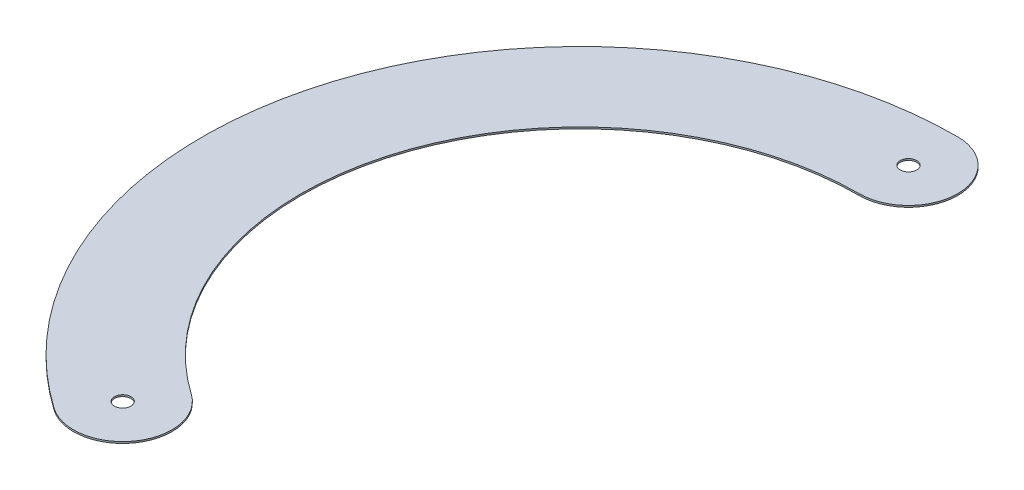
ISO-10303-21;
HEADER;
FILE_DESCRIPTION(('STEP AP214'),'2;1');
FILE_NAME('part.step','',(''),(''),'','','');
FILE_SCHEMA(('AUTOMOTIVE_DESIGN { 1 0 10303 214 1 1 1 1 }'));
ENDSEC;
DATA;
#1=APPLICATION_CONTEXT('core data for automotive mechanical design processes');
#2=APPLICATION_PROTOCOL_DEFINITION('international standard','automotive_design',2000,#1);
#3=PRODUCT_CONTEXT('',#1,'mechanical');
#4=PRODUCT('Part','Part','',(#3));
#5=PRODUCT_RELATED_PRODUCT_CATEGORY('part','',(#4));
#6=PRODUCT_DEFINITION_FORMATION('','',#4);
#7=PRODUCT_DEFINITION_CONTEXT('part definition',#1,'design');
#8=PRODUCT_DEFINITION('design','',#6,#7);
#9=PRODUCT_DEFINITION_SHAPE('','',#8);
#10=(LENGTH_UNIT() NAMED_UNIT(*) SI_UNIT(.MILLI.,.METRE.));
#11=(NAMED_UNIT(*) PLANE_ANGLE_UNIT() SI_UNIT($,.RADIAN.));
#12=(NAMED_UNIT(*) SI_UNIT($,.STERADIAN.) SOLID_ANGLE_UNIT());
#13=UNCERTAINTY_MEASURE_WITH_UNIT(LENGTH_MEASURE(1.E-05),#10,'distance_accuracy_value','');
#14=(GEOMETRIC_REPRESENTATION_CONTEXT(3) GLOBAL_UNCERTAINTY_ASSIGNED_CONTEXT((#13)) GLOBAL_UNIT_ASSIGNED_CONTEXT((#10,
#11,#12)) REPRESENTATION_CONTEXT('',''));
#15=CARTESIAN_POINT('',(0.,0.,0.));
#16=DIRECTION('',(0.,0.,1.));
#17=DIRECTION('',(1.,0.,0.));
#18=AXIS2_PLACEMENT_3D('',#15,#16,#17);
#19=CARTESIAN_POINT('',(0.,0.15,-15.));
#20=DIRECTION('',(0.,1.,0.));
#21=DIRECTION('',(0.,0.,1.));
#22=AXIS2_PLACEMENT_3D('',#19,#20,#21);
#23=PLANE('',#22);
#24=CARTESIAN_POINT('',(0.,0.15,-30.));
#25=DIRECTION('',(0.,1.,0.));
#26=DIRECTION('',(0.,0.,1.));
#27=AXIS2_PLACEMENT_3D('',#24,#25,#26);
#28=CIRCLE('',#27,0.750000000000001);
#29=CARTESIAN_POINT('',(0.,0.15,-29.25));
#30=VERTEX_POINT('',#29);
#31=EDGE_CURVE('E100',#30,#30,#28,.T.);
#32=ORIENTED_EDGE('',*,*,#31,.F.);
#33=EDGE_LOOP('',(#32));
#34=FACE_BOUND('',#33,.T.);
#35=CARTESIAN_POINT('',(0.,0.15,-30.));
#36=DIRECTION('',(0.,1.,0.));
#37=DIRECTION('',(0.,0.,1.));
#38=AXIS2_PLACEMENT_3D('',#35,#36,#37);
#39=CIRCLE('',#38,4.5);
#40=CARTESIAN_POINT('',(0.,0.15,-25.5));
#41=VERTEX_POINT('',#40);
#42=CARTESIAN_POINT('',(0.,0.15,-34.5));
#43=VERTEX_POINT('',#42);
#44=EDGE_CURVE('E85',#41,#43,#39,.T.);
#45=ORIENTED_EDGE('',*,*,#44,.T.);
#46=CARTESIAN_POINT('',(0.,0.15,0.));
#47=DIRECTION('',(0.,1.,0.));
#48=DIRECTION('',(0.,0.,1.));
#49=AXIS2_PLACEMENT_3D('',#46,#47,#48);
#50=CIRCLE('',#49,34.5);
#51=CARTESIAN_POINT('',(-19.7883870541111,0.15,28.2607455279702));
#52=VERTEX_POINT('',#51);
#53=EDGE_CURVE('E80',#43,#52,#50,.T.);
#54=ORIENTED_EDGE('',*,*,#53,.T.);
#55=CARTESIAN_POINT('',(-17.2072930905314,0.15,24.5745613286697));
#56=DIRECTION('',(0.,1.,0.));
#57=DIRECTION('',(0.,0.,1.));
#58=AXIS2_PLACEMENT_3D('',#55,#56,#57);
#59=CIRCLE('',#58,4.49999999999999);
#60=CARTESIAN_POINT('',(-14.6261991269517,0.15,20.8883771293693));
#61=VERTEX_POINT('',#60);
#62=EDGE_CURVE('E83',#52,#61,#59,.T.);
#63=ORIENTED_EDGE('',*,*,#62,.T.);
#64=CARTESIAN_POINT('',(0.,0.15,0.));
#65=DIRECTION('',(0.,-1.,0.));
#66=DIRECTION('',(0.,0.,1.));
#67=AXIS2_PLACEMENT_3D('',#64,#65,#66);
#68=CIRCLE('',#67,25.5);
#69=EDGE_CURVE('E50',#61,#41,#68,.T.);
#70=ORIENTED_EDGE('',*,*,#69,.T.);
#71=EDGE_LOOP('',(#45,#54,#63,#70));
#72=FACE_BOUND('',#71,.T.);
#73=CARTESIAN_POINT('',(-17.2072930905314,0.15,24.5745613286697));
#74=DIRECTION('',(0.,1.,0.));
#75=DIRECTION('',(0.,0.,1.));
#76=AXIS2_PLACEMENT_3D('',#73,#74,#75);
#77=CIRCLE('',#76,0.750000000000002);
#78=CARTESIAN_POINT('',(-17.2072930905314,0.15,25.3245613286697));
#79=VERTEX_POINT('',#78);
#80=EDGE_CURVE('E115',#79,#79,#77,.T.);
#81=ORIENTED_EDGE('',*,*,#80,.F.);
#82=EDGE_LOOP('',(#81));
#83=FACE_BOUND('',#82,.T.);
#84=ADVANCED_FACE('F33',(#34,#72,#83),#23,.T.);
#85=CARTESIAN_POINT('',(0.,0.,-15.));
#86=DIRECTION('',(0.,1.,0.));
#87=DIRECTION('',(0.,0.,1.));
#88=AXIS2_PLACEMENT_3D('',#85,#86,#87);
#89=PLANE('',#88);
#90=CARTESIAN_POINT('',(0.,0.,-30.));
#91=DIRECTION('',(0.,1.,0.));
#92=DIRECTION('',(0.,0.,1.));
#93=AXIS2_PLACEMENT_3D('',#90,#91,#92);
#94=CIRCLE('',#93,4.5);
#95=CARTESIAN_POINT('',(0.,0.,-25.5));
#96=VERTEX_POINT('',#95);
#97=CARTESIAN_POINT('',(0.,0.,-34.5));
#98=VERTEX_POINT('',#97);
#99=EDGE_CURVE('E97',#96,#98,#94,.T.);
#100=ORIENTED_EDGE('',*,*,#99,.F.);
#101=CARTESIAN_POINT('',(0.,0.,0.));
#102=DIRECTION('',(0.,-1.,0.));
#103=DIRECTION('',(0.,0.,1.));
#104=AXIS2_PLACEMENT_3D('',#101,#102,#103);
#105=CIRCLE('',#104,25.5);
#106=CARTESIAN_POINT('',(-14.6261991269517,0.,20.8883771293693));
#107=VERTEX_POINT('',#106);
#108=EDGE_CURVE('E73',#107,#96,#105,.T.);
#109=ORIENTED_EDGE('',*,*,#108,.F.);
#110=CARTESIAN_POINT('',(-17.2072930905314,0.,24.5745613286697));
#111=DIRECTION('',(0.,1.,0.));
#112=DIRECTION('',(0.,0.,1.));
#113=AXIS2_PLACEMENT_3D('',#110,#111,#112);
#114=CIRCLE('',#113,4.49999999999999);
#115=CARTESIAN_POINT('',(-19.7883870541111,0.,28.2607455279702));
#116=VERTEX_POINT('',#115);
#117=EDGE_CURVE('E67',#116,#107,#114,.T.);
#118=ORIENTED_EDGE('',*,*,#117,.F.);
#119=CARTESIAN_POINT('',(0.,0.,0.));
#120=DIRECTION('',(0.,1.,0.));
#121=DIRECTION('',(0.,0.,1.));
#122=AXIS2_PLACEMENT_3D('',#119,#120,#121);
#123=CIRCLE('',#122,34.5);
#124=EDGE_CURVE('E89',#98,#116,#123,.T.);
#125=ORIENTED_EDGE('',*,*,#124,.F.);
#126=EDGE_LOOP('',(#100,#109,#118,#125));
#127=FACE_BOUND('',#126,.T.);
#128=CARTESIAN_POINT('',(0.,0.,-30.));
#129=DIRECTION('',(0.,1.,0.));
#130=DIRECTION('',(0.,0.,1.));
#131=AXIS2_PLACEMENT_3D('',#128,#129,#130);
#132=CIRCLE('',#131,0.750000000000001);
#133=CARTESIAN_POINT('',(0.,0.,-29.25));
#134=VERTEX_POINT('',#133);
#135=EDGE_CURVE('E112',#134,#134,#132,.T.);
#136=ORIENTED_EDGE('',*,*,#135,.T.);
#137=EDGE_LOOP('',(#136));
#138=FACE_BOUND('',#137,.T.);
#139=CARTESIAN_POINT('',(-17.2072930905314,0.,24.5745613286697));
#140=DIRECTION('',(0.,1.,0.));
#141=DIRECTION('',(0.,0.,1.));
#142=AXIS2_PLACEMENT_3D('',#139,#140,#141);
#143=CIRCLE('',#142,0.750000000000002);
#144=CARTESIAN_POINT('',(-17.2072930905314,0.,25.3245613286697));
#145=VERTEX_POINT('',#144);
#146=EDGE_CURVE('E118',#145,#145,#143,.T.);
#147=ORIENTED_EDGE('',*,*,#146,.T.);
#148=EDGE_LOOP('',(#147));
#149=FACE_BOUND('',#148,.T.);
#150=ADVANCED_FACE('F108',(#127,#138,#149),#89,.F.);
#151=CARTESIAN_POINT('',(0.,0.15,-30.));
#152=DIRECTION('',(0.,-1.,0.));
#153=DIRECTION('',(0.,0.,-1.));
#154=AXIS2_PLACEMENT_3D('',#151,#152,#153);
#155=CYLINDRICAL_SURFACE('',#154,4.5);
#156=ORIENTED_EDGE('',*,*,#99,.T.);
#157=DIRECTION('',(0.,-1.,0.));
#158=VECTOR('',#157,1.);
#159=CARTESIAN_POINT('',(0.,0.15,-34.5));
#160=LINE('',#159,#158);
#161=EDGE_CURVE('E11',#43,#98,#160,.T.);
#162=ORIENTED_EDGE('',*,*,#161,.F.);
#163=ORIENTED_EDGE('',*,*,#44,.F.);
#164=DIRECTION('',(0.,-1.,0.));
#165=VECTOR('',#164,1.);
#166=CARTESIAN_POINT('',(0.,0.15,-25.5));
#167=LINE('',#166,#165);
#168=EDGE_CURVE('E93',#41,#96,#167,.T.);
#169=ORIENTED_EDGE('',*,*,#168,.T.);
#170=EDGE_LOOP('',(#156,#162,#163,#169));
#171=FACE_BOUND('',#170,.T.);
#172=ADVANCED_FACE('F35',(#171),#155,.T.);
#173=CARTESIAN_POINT('',(0.,0.15,0.));
#174=DIRECTION('',(0.,-1.,0.));
#175=DIRECTION('',(0.,0.,-1.));
#176=AXIS2_PLACEMENT_3D('',#173,#174,#175);
#177=CYLINDRICAL_SURFACE('',#176,34.5);
#178=ORIENTED_EDGE('',*,*,#124,.T.);
#179=DIRECTION('',(0.,-1.,0.));
#180=VECTOR('',#179,1.);
#181=CARTESIAN_POINT('',(-19.7883870541111,0.15,28.2607455279702));
#182=LINE('',#181,#180);
#183=EDGE_CURVE('E42',#52,#116,#182,.T.);
#184=ORIENTED_EDGE('',*,*,#183,.F.);
#185=ORIENTED_EDGE('',*,*,#53,.F.);
#186=ORIENTED_EDGE('',*,*,#161,.T.);
#187=EDGE_LOOP('',(#178,#184,#185,#186));
#188=FACE_BOUND('',#187,.T.);
#189=ADVANCED_FACE('F88',(#188),#177,.T.);
#190=CARTESIAN_POINT('',(-17.2072930905314,0.15,24.5745613286697));
#191=DIRECTION('',(0.,-1.,0.));
#192=DIRECTION('',(0.,0.,-1.));
#193=AXIS2_PLACEMENT_3D('',#190,#191,#192);
#194=CYLINDRICAL_SURFACE('',#193,4.49999999999999);
#195=ORIENTED_EDGE('',*,*,#117,.T.);
#196=DIRECTION('',(0.,-1.,0.));
#197=VECTOR('',#196,1.);
#198=CARTESIAN_POINT('',(-14.6261991269517,0.15,20.8883771293693));
#199=LINE('',#198,#197);
#200=EDGE_CURVE('E90',#61,#107,#199,.T.);
#201=ORIENTED_EDGE('',*,*,#200,.F.);
#202=ORIENTED_EDGE('',*,*,#62,.F.);
#203=ORIENTED_EDGE('',*,*,#183,.T.);
#204=EDGE_LOOP('',(#195,#201,#202,#203));
#205=FACE_BOUND('',#204,.T.);
#206=ADVANCED_FACE('F91',(#205),#194,.T.);
#207=CARTESIAN_POINT('',(0.,0.15,0.));
#208=DIRECTION('',(0.,-1.,0.));
#209=DIRECTION('',(0.,0.,-1.));
#210=AXIS2_PLACEMENT_3D('',#207,#208,#209);
#211=CYLINDRICAL_SURFACE('',#210,25.5);
#212=ORIENTED_EDGE('',*,*,#108,.T.);
#213=ORIENTED_EDGE('',*,*,#168,.F.);
#214=ORIENTED_EDGE('',*,*,#69,.F.);
#215=ORIENTED_EDGE('',*,*,#200,.T.);
#216=EDGE_LOOP('',(#212,#213,#214,#215));
#217=FACE_BOUND('',#216,.T.);
#218=ADVANCED_FACE('F105',(#217),#211,.F.);
#219=CARTESIAN_POINT('',(0.,0.15,-30.));
#220=DIRECTION('',(0.,-1.,0.));
#221=DIRECTION('',(0.,0.,-1.));
#222=AXIS2_PLACEMENT_3D('',#219,#220,#221);
#223=CYLINDRICAL_SURFACE('',#222,0.750000000000001);
#224=ORIENTED_EDGE('',*,*,#31,.T.);
#225=EDGE_LOOP('',(#224));
#226=FACE_BOUND('',#225,.T.);
#227=ORIENTED_EDGE('',*,*,#135,.F.);
#228=EDGE_LOOP('',(#227));
#229=FACE_BOUND('',#228,.T.);
#230=ADVANCED_FACE('F135',(#226,#229),#223,.F.);
#231=CARTESIAN_POINT('',(-17.2072930905314,0.15,24.5745613286697));
#232=DIRECTION('',(0.,-1.,0.));
#233=DIRECTION('',(0.,0.,-1.));
#234=AXIS2_PLACEMENT_3D('',#231,#232,#233);
#235=CYLINDRICAL_SURFACE('',#234,0.750000000000002);
#236=ORIENTED_EDGE('',*,*,#80,.T.);
#237=EDGE_LOOP('',(#236));
#238=FACE_BOUND('',#237,.T.);
#239=ORIENTED_EDGE('',*,*,#146,.F.);
#240=EDGE_LOOP('',(#239));
#241=FACE_BOUND('',#240,.T.);
#242=ADVANCED_FACE('F124',(#238,#241),#235,.F.);
#243=CLOSED_SHELL('',(#84,#150,#172,#189,#206,#218,#230,#242));
#244=MANIFOLD_SOLID_BREP('B2',#243);
#245=ADVANCED_BREP_SHAPE_REPRESENTATION('',(#18,#244),#14);
#246=SHAPE_DEFINITION_REPRESENTATION(#9,#245);
ENDSEC;
END-ISO-10303-21;
